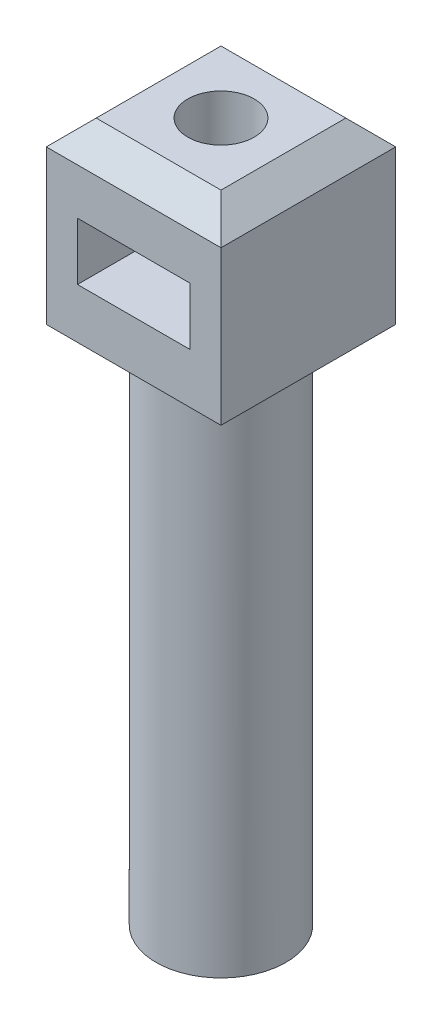
ISO-10303-21;
HEADER;
FILE_DESCRIPTION(('STEP AP214'),'2;1');
FILE_NAME('part.step','',(''),(''),'','','');
FILE_SCHEMA(('AUTOMOTIVE_DESIGN { 1 0 10303 214 1 1 1 1 }'));
ENDSEC;
DATA;
#1=APPLICATION_CONTEXT('core data for automotive mechanical design processes');
#2=APPLICATION_PROTOCOL_DEFINITION('international standard','automotive_design',2000,#1);
#3=PRODUCT_CONTEXT('',#1,'mechanical');
#4=PRODUCT('Part','Part','',(#3));
#5=PRODUCT_RELATED_PRODUCT_CATEGORY('part','',(#4));
#6=PRODUCT_DEFINITION_FORMATION('','',#4);
#7=PRODUCT_DEFINITION_CONTEXT('part definition',#1,'design');
#8=PRODUCT_DEFINITION('design','',#6,#7);
#9=PRODUCT_DEFINITION_SHAPE('','',#8);
#10=(LENGTH_UNIT() NAMED_UNIT(*) SI_UNIT(.MILLI.,.METRE.));
#11=(NAMED_UNIT(*) PLANE_ANGLE_UNIT() SI_UNIT($,.RADIAN.));
#12=(NAMED_UNIT(*) SI_UNIT($,.STERADIAN.) SOLID_ANGLE_UNIT());
#13=UNCERTAINTY_MEASURE_WITH_UNIT(LENGTH_MEASURE(1.E-05),#10,'distance_accuracy_value','');
#14=(GEOMETRIC_REPRESENTATION_CONTEXT(3) GLOBAL_UNCERTAINTY_ASSIGNED_CONTEXT((#13)) GLOBAL_UNIT_ASSIGNED_CONTEXT((#10,
#11,#12)) REPRESENTATION_CONTEXT('',''));
#15=CARTESIAN_POINT('',(0.,0.,0.));
#16=DIRECTION('',(0.,0.,1.));
#17=DIRECTION('',(1.,0.,0.));
#18=AXIS2_PLACEMENT_3D('',#15,#16,#17);
#19=CARTESIAN_POINT('',(0.,50.8,0.));
#20=DIRECTION('',(0.,-1.,0.));
#21=DIRECTION('',(0.,0.,-1.));
#22=AXIS2_PLACEMENT_3D('',#19,#20,#21);
#23=PLANE('',#22);
#24=DIRECTION('',(0.,0.,-1.));
#25=VECTOR('',#24,1.);
#26=CARTESIAN_POINT('',(-6.34999999999998,50.8,-8.89));
#27=LINE('',#26,#25);
#28=CARTESIAN_POINT('',(-6.34999999999998,50.8,-1.81392282084995));
#29=VERTEX_POINT('',#28);
#30=CARTESIAN_POINT('',(-6.34999999999998,50.8,-6.34999999999998));
#31=VERTEX_POINT('',#30);
#32=EDGE_CURVE('E191',#29,#31,#27,.T.);
#33=ORIENTED_EDGE('',*,*,#32,.T.);
#34=DIRECTION('',(1.,0.,0.));
#35=VECTOR('',#34,1.);
#36=CARTESIAN_POINT('',(8.89,50.8,-6.34999999999998));
#37=LINE('',#36,#35);
#38=CARTESIAN_POINT('',(-1.81392282084994,50.8,-6.34999999999998));
#39=VERTEX_POINT('',#38);
#40=EDGE_CURVE('E193',#31,#39,#37,.T.);
#41=ORIENTED_EDGE('',*,*,#40,.T.);
#42=CARTESIAN_POINT('',(0.,50.8,0.));
#43=DIRECTION('',(0.,-1.,0.));
#44=DIRECTION('',(0.,0.,-1.));
#45=AXIS2_PLACEMENT_3D('',#42,#43,#44);
#46=CIRCLE('',#45,6.604);
#47=EDGE_CURVE('E286',#29,#39,#46,.T.);
#48=ORIENTED_EDGE('',*,*,#47,.F.);
#49=EDGE_LOOP('',(#33,#41,#48));
#50=FACE_BOUND('',#49,.T.);
#51=ADVANCED_FACE('F32',(#50),#23,.T.);
#52=CARTESIAN_POINT('',(1.81392282084994,50.8,-6.34999999999998));
#53=VERTEX_POINT('',#52);
#54=CARTESIAN_POINT('',(6.34999999999999,50.8,-1.81392282084993));
#55=VERTEX_POINT('',#54);
#56=EDGE_CURVE('E156',#53,#55,#46,.T.);
#57=ORIENTED_EDGE('',*,*,#56,.F.);
#58=DIRECTION('',(1.,0.,0.));
#59=VECTOR('',#58,1.);
#60=CARTESIAN_POINT('',(8.89,50.8,-6.34999999999998));
#61=LINE('',#60,#59);
#62=CARTESIAN_POINT('',(6.34999999999999,50.8,-6.34999999999998));
#63=VERTEX_POINT('',#62);
#64=EDGE_CURVE('E189',#53,#63,#61,.T.);
#65=ORIENTED_EDGE('',*,*,#64,.T.);
#66=DIRECTION('',(0.,0.,1.));
#67=VECTOR('',#66,1.);
#68=CARTESIAN_POINT('',(6.34999999999999,50.8,8.89));
#69=LINE('',#68,#67);
#70=EDGE_CURVE('E187',#63,#55,#69,.T.);
#71=ORIENTED_EDGE('',*,*,#70,.T.);
#72=EDGE_LOOP('',(#57,#65,#71));
#73=FACE_BOUND('',#72,.T.);
#74=ADVANCED_FACE('F317',(#73),#23,.T.);
#75=CARTESIAN_POINT('',(6.34999999999999,50.8,1.81392282084993));
#76=VERTEX_POINT('',#75);
#77=CARTESIAN_POINT('',(1.81392282084994,50.8,6.34999999999998));
#78=VERTEX_POINT('',#77);
#79=EDGE_CURVE('E288',#76,#78,#46,.T.);
#80=ORIENTED_EDGE('',*,*,#79,.F.);
#81=DIRECTION('',(0.,0.,1.));
#82=VECTOR('',#81,1.);
#83=CARTESIAN_POINT('',(6.34999999999999,50.8,8.89));
#84=LINE('',#83,#82);
#85=CARTESIAN_POINT('',(6.34999999999999,50.8,6.34999999999998));
#86=VERTEX_POINT('',#85);
#87=EDGE_CURVE('E185',#76,#86,#84,.T.);
#88=ORIENTED_EDGE('',*,*,#87,.T.);
#89=DIRECTION('',(-1.,0.,0.));
#90=VECTOR('',#89,1.);
#91=CARTESIAN_POINT('',(-8.89,50.8,6.34999999999998));
#92=LINE('',#91,#90);
#93=EDGE_CURVE('E183',#86,#78,#92,.T.);
#94=ORIENTED_EDGE('',*,*,#93,.T.);
#95=EDGE_LOOP('',(#80,#88,#94));
#96=FACE_BOUND('',#95,.T.);
#97=ADVANCED_FACE('F338',(#96),#23,.T.);
#98=CARTESIAN_POINT('',(0.,63.5,0.));
#99=DIRECTION('',(0.,-1.,0.));
#100=DIRECTION('',(0.,0.,-1.));
#101=AXIS2_PLACEMENT_3D('',#98,#99,#100);
#102=CYLINDRICAL_SURFACE('',#101,6.604);
#103=ORIENTED_EDGE('',*,*,#56,.T.);
#104=CARTESIAN_POINT('',(0.,45.4717173420242,0.));
#105=DIRECTION('',(0.642787609686544,-0.766044443118974,0.));
#106=DIRECTION('',(-0.766044443118974,-0.642787609686544,0.));
#107=AXIS2_PLACEMENT_3D('',#104,#105,#106);
#108=ELLIPSE('',#107,8.62090973875041,6.604);
#109=EDGE_CURVE('E209',#55,#76,#108,.T.);
#110=ORIENTED_EDGE('',*,*,#109,.T.);
#111=ORIENTED_EDGE('',*,*,#79,.T.);
#112=CARTESIAN_POINT('',(0.,45.4717173420242,0.));
#113=DIRECTION('',(0.,-0.766044443118974,0.642787609686544));
#114=DIRECTION('',(0.,-0.642787609686544,-0.766044443118974));
#115=AXIS2_PLACEMENT_3D('',#112,#113,#114);
#116=ELLIPSE('',#115,8.62090973875041,6.604);
#117=CARTESIAN_POINT('',(-1.81392282084994,50.8,6.34999999999998));
#118=VERTEX_POINT('',#117);
#119=EDGE_CURVE('E211',#78,#118,#116,.T.);
#120=ORIENTED_EDGE('',*,*,#119,.T.);
#121=CARTESIAN_POINT('',(-6.34999999999998,50.8,1.81392282084995));
#122=VERTEX_POINT('',#121);
#123=EDGE_CURVE('E293',#118,#122,#46,.T.);
#124=ORIENTED_EDGE('',*,*,#123,.T.);
#125=CARTESIAN_POINT('',(0.,45.4717173420242,0.));
#126=DIRECTION('',(-0.642787609686544,-0.766044443118974,0.));
#127=DIRECTION('',(0.766044443118974,-0.642787609686544,0.));
#128=AXIS2_PLACEMENT_3D('',#125,#126,#127);
#129=ELLIPSE('',#128,8.62090973875041,6.604);
#130=EDGE_CURVE('E207',#122,#29,#129,.T.);
#131=ORIENTED_EDGE('',*,*,#130,.T.);
#132=ORIENTED_EDGE('',*,*,#47,.T.);
#133=CARTESIAN_POINT('',(0.,45.4717173420242,0.));
#134=DIRECTION('',(0.,-0.766044443118974,-0.642787609686544));
#135=DIRECTION('',(0.,-0.642787609686544,0.766044443118974));
#136=AXIS2_PLACEMENT_3D('',#133,#134,#135);
#137=ELLIPSE('',#136,8.62090973875041,6.604);
#138=EDGE_CURVE('E205',#39,#53,#137,.T.);
#139=ORIENTED_EDGE('',*,*,#138,.T.);
#140=EDGE_LOOP('',(#103,#110,#111,#120,#124,#131,#132,#139));
#141=FACE_BOUND('',#140,.T.);
#142=CARTESIAN_POINT('',(0.,0.,0.));
#143=DIRECTION('',(0.,-1.,0.));
#144=DIRECTION('',(0.,0.,-1.));
#145=AXIS2_PLACEMENT_3D('',#142,#143,#144);
#146=CIRCLE('',#145,6.604);
#147=CARTESIAN_POINT('',(0.,0.,-6.604));
#148=VERTEX_POINT('',#147);
#149=EDGE_CURVE('E218',#148,#148,#146,.T.);
#150=ORIENTED_EDGE('',*,*,#149,.F.);
#151=EDGE_LOOP('',(#150));
#152=FACE_BOUND('',#151,.T.);
#153=ADVANCED_FACE('F299',(#141,#152),#102,.T.);
#154=DIRECTION('',(-1.,0.,0.));
#155=VECTOR('',#154,1.);
#156=CARTESIAN_POINT('',(-8.89,50.8,6.34999999999998));
#157=LINE('',#156,#155);
#158=CARTESIAN_POINT('',(-6.34999999999998,50.8,6.34999999999998));
#159=VERTEX_POINT('',#158);
#160=EDGE_CURVE('E179',#118,#159,#157,.T.);
#161=ORIENTED_EDGE('',*,*,#160,.T.);
#162=DIRECTION('',(0.,0.,-1.));
#163=VECTOR('',#162,1.);
#164=CARTESIAN_POINT('',(-6.34999999999998,50.8,-8.89));
#165=LINE('',#164,#163);
#166=EDGE_CURVE('E181',#159,#122,#165,.T.);
#167=ORIENTED_EDGE('',*,*,#166,.T.);
#168=ORIENTED_EDGE('',*,*,#123,.F.);
#169=EDGE_LOOP('',(#161,#167,#168));
#170=FACE_BOUND('',#169,.T.);
#171=ADVANCED_FACE('F341',(#170),#23,.T.);
#172=CARTESIAN_POINT('',(8.89,71.12,8.89));
#173=DIRECTION('',(-1.,0.,0.));
#174=DIRECTION('',(0.,0.,1.));
#175=AXIS2_PLACEMENT_3D('',#172,#173,#174);
#176=PLANE('',#175);
#177=DIRECTION('',(0.,-1.,0.));
#178=VECTOR('',#177,1.);
#179=CARTESIAN_POINT('',(8.89,71.12,-8.89));
#180=LINE('',#179,#178);
#181=CARTESIAN_POINT('',(8.89,68.58,-8.89));
#182=VERTEX_POINT('',#181);
#183=CARTESIAN_POINT('',(8.89,52.9313130631903,-8.89));
#184=VERTEX_POINT('',#183);
#185=EDGE_CURVE('E285',#182,#184,#180,.T.);
#186=ORIENTED_EDGE('',*,*,#185,.F.);
#187=DIRECTION('',(0.,0.,1.));
#188=VECTOR('',#187,1.);
#189=CARTESIAN_POINT('',(8.89,68.58,8.89));
#190=LINE('',#189,#188);
#191=CARTESIAN_POINT('',(8.89,68.58,8.89));
#192=VERTEX_POINT('',#191);
#193=EDGE_CURVE('E229',#182,#192,#190,.T.);
#194=ORIENTED_EDGE('',*,*,#193,.T.);
#195=DIRECTION('',(0.,-1.,0.));
#196=VECTOR('',#195,1.);
#197=CARTESIAN_POINT('',(8.89,71.12,8.89));
#198=LINE('',#197,#196);
#199=CARTESIAN_POINT('',(8.89,52.9313130631903,8.89));
#200=VERTEX_POINT('',#199);
#201=EDGE_CURVE('E279',#192,#200,#198,.T.);
#202=ORIENTED_EDGE('',*,*,#201,.T.);
#203=DIRECTION('',(0.,0.,-1.));
#204=VECTOR('',#203,1.);
#205=CARTESIAN_POINT('',(8.89,52.9313130631903,-8.89));
#206=LINE('',#205,#204);
#207=EDGE_CURVE('E199',#200,#184,#206,.T.);
#208=ORIENTED_EDGE('',*,*,#207,.T.);
#209=EDGE_LOOP('',(#186,#194,#202,#208));
#210=FACE_BOUND('',#209,.T.);
#211=ADVANCED_FACE('F329',(#210),#176,.F.);
#212=CARTESIAN_POINT('',(-8.89,71.12,-8.89));
#213=DIRECTION('',(0.,0.,1.));
#214=DIRECTION('',(1.,0.,0.));
#215=AXIS2_PLACEMENT_3D('',#212,#213,#214);
#216=PLANE('',#215);
#217=DIRECTION('',(1.,0.,0.));
#218=VECTOR('',#217,1.);
#219=CARTESIAN_POINT('',(-8.89,58.039,-8.89));
#220=LINE('',#219,#218);
#221=CARTESIAN_POINT('',(-5.71500000000003,58.039,-8.89));
#222=VERTEX_POINT('',#221);
#223=CARTESIAN_POINT('',(5.71499999999997,58.039,-8.89));
#224=VERTEX_POINT('',#223);
#225=EDGE_CURVE('E273',#222,#224,#220,.T.);
#226=ORIENTED_EDGE('',*,*,#225,.T.);
#227=DIRECTION('',(0.,1.,0.));
#228=VECTOR('',#227,1.);
#229=CARTESIAN_POINT('',(5.71499999999997,71.12,-8.89));
#230=LINE('',#229,#228);
#231=CARTESIAN_POINT('',(5.71499999999997,63.881,-8.89));
#232=VERTEX_POINT('',#231);
#233=EDGE_CURVE('E276',#224,#232,#230,.T.);
#234=ORIENTED_EDGE('',*,*,#233,.T.);
#235=DIRECTION('',(-1.,0.,0.));
#236=VECTOR('',#235,1.);
#237=CARTESIAN_POINT('',(-8.89,63.881,-8.89));
#238=LINE('',#237,#236);
#239=CARTESIAN_POINT('',(-5.71500000000003,63.881,-8.89));
#240=VERTEX_POINT('',#239);
#241=EDGE_CURVE('E268',#232,#240,#238,.T.);
#242=ORIENTED_EDGE('',*,*,#241,.T.);
#243=DIRECTION('',(0.,-1.,0.));
#244=VECTOR('',#243,1.);
#245=CARTESIAN_POINT('',(-5.71500000000003,71.12,-8.89));
#246=LINE('',#245,#244);
#247=EDGE_CURVE('E163',#240,#222,#246,.T.);
#248=ORIENTED_EDGE('',*,*,#247,.T.);
#249=EDGE_LOOP('',(#226,#234,#242,#248));
#250=FACE_BOUND('',#249,.T.);
#251=DIRECTION('',(0.,-1.,0.));
#252=VECTOR('',#251,1.);
#253=CARTESIAN_POINT('',(-8.89,71.12,-8.89));
#254=LINE('',#253,#252);
#255=CARTESIAN_POINT('',(-8.89,68.58,-8.89));
#256=VERTEX_POINT('',#255);
#257=CARTESIAN_POINT('',(-8.89,52.9313130631903,-8.89));
#258=VERTEX_POINT('',#257);
#259=EDGE_CURVE('E283',#256,#258,#254,.T.);
#260=ORIENTED_EDGE('',*,*,#259,.F.);
#261=DIRECTION('',(1.,0.,0.));
#262=VECTOR('',#261,1.);
#263=CARTESIAN_POINT('',(-8.89,68.58,-8.89));
#264=LINE('',#263,#262);
#265=EDGE_CURVE('E239',#256,#182,#264,.T.);
#266=ORIENTED_EDGE('',*,*,#265,.T.);
#267=ORIENTED_EDGE('',*,*,#185,.T.);
#268=DIRECTION('',(-1.,0.,0.));
#269=VECTOR('',#268,1.);
#270=CARTESIAN_POINT('',(-8.89,52.9313130631903,-8.89));
#271=LINE('',#270,#269);
#272=EDGE_CURVE('E176',#184,#258,#271,.T.);
#273=ORIENTED_EDGE('',*,*,#272,.T.);
#274=EDGE_LOOP('',(#260,#266,#267,#273));
#275=FACE_BOUND('',#274,.T.);
#276=ADVANCED_FACE('F325',(#250,#275),#216,.F.);
#277=CARTESIAN_POINT('',(-8.89,71.12,8.89));
#278=DIRECTION('',(1.,0.,0.));
#279=DIRECTION('',(0.,0.,-1.));
#280=AXIS2_PLACEMENT_3D('',#277,#278,#279);
#281=PLANE('',#280);
#282=DIRECTION('',(0.,-1.,0.));
#283=VECTOR('',#282,1.);
#284=CARTESIAN_POINT('',(-8.89,71.12,8.89));
#285=LINE('',#284,#283);
#286=CARTESIAN_POINT('',(-8.89,68.58,8.89));
#287=VERTEX_POINT('',#286);
#288=CARTESIAN_POINT('',(-8.89,52.9313130631903,8.89));
#289=VERTEX_POINT('',#288);
#290=EDGE_CURVE('E281',#287,#289,#285,.T.);
#291=ORIENTED_EDGE('',*,*,#290,.F.);
#292=DIRECTION('',(0.,0.,-1.));
#293=VECTOR('',#292,1.);
#294=CARTESIAN_POINT('',(-8.89,68.58,8.89));
#295=LINE('',#294,#293);
#296=EDGE_CURVE('E41',#287,#256,#295,.T.);
#297=ORIENTED_EDGE('',*,*,#296,.T.);
#298=ORIENTED_EDGE('',*,*,#259,.T.);
#299=DIRECTION('',(0.,0.,1.));
#300=VECTOR('',#299,1.);
#301=CARTESIAN_POINT('',(-8.89,52.9313130631903,8.89));
#302=LINE('',#301,#300);
#303=EDGE_CURVE('E196',#258,#289,#302,.T.);
#304=ORIENTED_EDGE('',*,*,#303,.T.);
#305=EDGE_LOOP('',(#291,#297,#298,#304));
#306=FACE_BOUND('',#305,.T.);
#307=ADVANCED_FACE('F457',(#306),#281,.F.);
#308=CARTESIAN_POINT('',(-8.89,71.12,8.89));
#309=DIRECTION('',(0.,0.,-1.));
#310=DIRECTION('',(-1.,0.,0.));
#311=AXIS2_PLACEMENT_3D('',#308,#309,#310);
#312=PLANE('',#311);
#313=DIRECTION('',(1.,0.,0.));
#314=VECTOR('',#313,1.);
#315=CARTESIAN_POINT('',(-8.89,63.881,8.89));
#316=LINE('',#315,#314);
#317=CARTESIAN_POINT('',(-5.71500000000003,63.881,8.89));
#318=VERTEX_POINT('',#317);
#319=CARTESIAN_POINT('',(5.71499999999997,63.881,8.89));
#320=VERTEX_POINT('',#319);
#321=EDGE_CURVE('E144',#318,#320,#316,.T.);
#322=ORIENTED_EDGE('',*,*,#321,.T.);
#323=DIRECTION('',(0.,-1.,0.));
#324=VECTOR('',#323,1.);
#325=CARTESIAN_POINT('',(5.71499999999997,71.12,8.89));
#326=LINE('',#325,#324);
#327=CARTESIAN_POINT('',(5.71499999999997,58.039,8.89));
#328=VERTEX_POINT('',#327);
#329=EDGE_CURVE('E171',#320,#328,#326,.T.);
#330=ORIENTED_EDGE('',*,*,#329,.T.);
#331=DIRECTION('',(-1.,0.,0.));
#332=VECTOR('',#331,1.);
#333=CARTESIAN_POINT('',(-8.89,58.039,8.89));
#334=LINE('',#333,#332);
#335=CARTESIAN_POINT('',(-5.71500000000003,58.039,8.89));
#336=VERTEX_POINT('',#335);
#337=EDGE_CURVE('E169',#328,#336,#334,.T.);
#338=ORIENTED_EDGE('',*,*,#337,.T.);
#339=DIRECTION('',(0.,1.,0.));
#340=VECTOR('',#339,1.);
#341=CARTESIAN_POINT('',(-5.71500000000003,71.12,8.89));
#342=LINE('',#341,#340);
#343=EDGE_CURVE('E155',#336,#318,#342,.T.);
#344=ORIENTED_EDGE('',*,*,#343,.T.);
#345=EDGE_LOOP('',(#322,#330,#338,#344));
#346=FACE_BOUND('',#345,.T.);
#347=ORIENTED_EDGE('',*,*,#201,.F.);
#348=DIRECTION('',(-1.,0.,0.));
#349=VECTOR('',#348,1.);
#350=CARTESIAN_POINT('',(-8.89,68.58,8.89));
#351=LINE('',#350,#349);
#352=EDGE_CURVE('E11',#192,#287,#351,.T.);
#353=ORIENTED_EDGE('',*,*,#352,.T.);
#354=ORIENTED_EDGE('',*,*,#290,.T.);
#355=DIRECTION('',(1.,0.,0.));
#356=VECTOR('',#355,1.);
#357=CARTESIAN_POINT('',(8.89,52.9313130631903,8.89));
#358=LINE('',#357,#356);
#359=EDGE_CURVE('E202',#289,#200,#358,.T.);
#360=ORIENTED_EDGE('',*,*,#359,.T.);
#361=EDGE_LOOP('',(#347,#353,#354,#360));
#362=FACE_BOUND('',#361,.T.);
#363=ADVANCED_FACE('F168',(#346,#362),#312,.F.);
#364=CARTESIAN_POINT('',(0.,71.12,0.));
#365=DIRECTION('',(0.,-1.,0.));
#366=DIRECTION('',(0.,0.,-1.));
#367=AXIS2_PLACEMENT_3D('',#364,#365,#366);
#368=PLANE('',#367);
#369=CARTESIAN_POINT('',(0.,71.12,0.));
#370=DIRECTION('',(0.,1.,0.));
#371=DIRECTION('',(0.,0.,1.));
#372=AXIS2_PLACEMENT_3D('',#369,#370,#371);
#373=CIRCLE('',#372,3.37819999999999);
#374=CARTESIAN_POINT('',(0.,71.12,3.37819999999999));
#375=VERTEX_POINT('',#374);
#376=EDGE_CURVE('E252',#375,#375,#373,.T.);
#377=ORIENTED_EDGE('',*,*,#376,.F.);
#378=EDGE_LOOP('',(#377));
#379=FACE_BOUND('',#378,.T.);
#380=DIRECTION('',(0.,0.,-1.));
#381=VECTOR('',#380,1.);
#382=CARTESIAN_POINT('',(6.35,71.12,0.));
#383=LINE('',#382,#381);
#384=CARTESIAN_POINT('',(6.35,71.12,6.35));
#385=VERTEX_POINT('',#384);
#386=CARTESIAN_POINT('',(6.35,71.12,-6.35));
#387=VERTEX_POINT('',#386);
#388=EDGE_CURVE('E213',#385,#387,#383,.T.);
#389=ORIENTED_EDGE('',*,*,#388,.T.);
#390=DIRECTION('',(-1.,0.,0.));
#391=VECTOR('',#390,1.);
#392=CARTESIAN_POINT('',(0.,71.12,-6.35));
#393=LINE('',#392,#391);
#394=CARTESIAN_POINT('',(-6.35,71.12,-6.35));
#395=VERTEX_POINT('',#394);
#396=EDGE_CURVE('E236',#387,#395,#393,.T.);
#397=ORIENTED_EDGE('',*,*,#396,.T.);
#398=DIRECTION('',(0.,0.,1.));
#399=VECTOR('',#398,1.);
#400=CARTESIAN_POINT('',(-6.35,71.12,0.));
#401=LINE('',#400,#399);
#402=CARTESIAN_POINT('',(-6.35,71.12,6.35));
#403=VERTEX_POINT('',#402);
#404=EDGE_CURVE('E234',#395,#403,#401,.T.);
#405=ORIENTED_EDGE('',*,*,#404,.T.);
#406=DIRECTION('',(1.,0.,0.));
#407=VECTOR('',#406,1.);
#408=CARTESIAN_POINT('',(0.,71.12,6.35));
#409=LINE('',#408,#407);
#410=EDGE_CURVE('E232',#403,#385,#409,.T.);
#411=ORIENTED_EDGE('',*,*,#410,.T.);
#412=EDGE_LOOP('',(#389,#397,#405,#411));
#413=FACE_BOUND('',#412,.T.);
#414=ADVANCED_FACE('F475',(#379,#413),#368,.F.);
#415=CARTESIAN_POINT('',(5.71499999999997,58.039,-12.7));
#416=DIRECTION('',(1.,0.,0.));
#417=DIRECTION('',(0.,0.,-1.));
#418=AXIS2_PLACEMENT_3D('',#415,#416,#417);
#419=PLANE('',#418);
#420=DIRECTION('',(0.,0.,1.));
#421=VECTOR('',#420,1.);
#422=CARTESIAN_POINT('',(5.71499999999997,58.039,-12.7));
#423=LINE('',#422,#421);
#424=EDGE_CURVE('E265',#224,#328,#423,.T.);
#425=ORIENTED_EDGE('',*,*,#424,.T.);
#426=ORIENTED_EDGE('',*,*,#329,.F.);
#427=DIRECTION('',(0.,0.,1.));
#428=VECTOR('',#427,1.);
#429=CARTESIAN_POINT('',(5.71499999999997,63.881,-12.7));
#430=LINE('',#429,#428);
#431=EDGE_CURVE('E150',#232,#320,#430,.T.);
#432=ORIENTED_EDGE('',*,*,#431,.F.);
#433=ORIENTED_EDGE('',*,*,#233,.F.);
#434=EDGE_LOOP('',(#425,#426,#432,#433));
#435=FACE_BOUND('',#434,.T.);
#436=ADVANCED_FACE('F483',(#435),#419,.F.);
#437=CARTESIAN_POINT('',(-5.71500000000003,58.039,-12.7));
#438=DIRECTION('',(0.,-1.,0.));
#439=DIRECTION('',(0.,0.,-1.));
#440=AXIS2_PLACEMENT_3D('',#437,#438,#439);
#441=PLANE('',#440);
#442=DIRECTION('',(0.,0.,1.));
#443=VECTOR('',#442,1.);
#444=CARTESIAN_POINT('',(-5.71500000000003,58.039,-12.7));
#445=LINE('',#444,#443);
#446=EDGE_CURVE('E165',#222,#336,#445,.T.);
#447=ORIENTED_EDGE('',*,*,#446,.T.);
#448=ORIENTED_EDGE('',*,*,#337,.F.);
#449=ORIENTED_EDGE('',*,*,#424,.F.);
#450=ORIENTED_EDGE('',*,*,#225,.F.);
#451=EDGE_LOOP('',(#447,#448,#449,#450));
#452=FACE_BOUND('',#451,.T.);
#453=ADVANCED_FACE('F529',(#452),#441,.F.);
#454=CARTESIAN_POINT('',(-5.71500000000003,58.039,-12.7));
#455=DIRECTION('',(-1.,0.,0.));
#456=DIRECTION('',(0.,0.,1.));
#457=AXIS2_PLACEMENT_3D('',#454,#455,#456);
#458=PLANE('',#457);
#459=DIRECTION('',(0.,0.,1.));
#460=VECTOR('',#459,1.);
#461=CARTESIAN_POINT('',(-5.71500000000003,63.881,-12.7));
#462=LINE('',#461,#460);
#463=EDGE_CURVE('E147',#240,#318,#462,.T.);
#464=ORIENTED_EDGE('',*,*,#463,.T.);
#465=ORIENTED_EDGE('',*,*,#343,.F.);
#466=ORIENTED_EDGE('',*,*,#446,.F.);
#467=ORIENTED_EDGE('',*,*,#247,.F.);
#468=EDGE_LOOP('',(#464,#465,#466,#467));
#469=FACE_BOUND('',#468,.T.);
#470=ADVANCED_FACE('F159',(#469),#458,.F.);
#471=CARTESIAN_POINT('',(-5.71500000000003,63.881,-12.7));
#472=DIRECTION('',(0.,1.,0.));
#473=DIRECTION('',(0.,0.,1.));
#474=AXIS2_PLACEMENT_3D('',#471,#472,#473);
#475=PLANE('',#474);
#476=CARTESIAN_POINT('',(0.,63.881,0.));
#477=DIRECTION('',(0.,1.,0.));
#478=DIRECTION('',(0.,0.,1.));
#479=AXIS2_PLACEMENT_3D('',#476,#477,#478);
#480=CIRCLE('',#479,3.3782);
#481=CARTESIAN_POINT('',(0.,63.881,3.3782));
#482=VERTEX_POINT('',#481);
#483=EDGE_CURVE('E256',#482,#482,#480,.T.);
#484=ORIENTED_EDGE('',*,*,#483,.T.);
#485=EDGE_LOOP('',(#484));
#486=FACE_BOUND('',#485,.T.);
#487=ORIENTED_EDGE('',*,*,#431,.T.);
#488=ORIENTED_EDGE('',*,*,#321,.F.);
#489=ORIENTED_EDGE('',*,*,#463,.F.);
#490=ORIENTED_EDGE('',*,*,#241,.F.);
#491=EDGE_LOOP('',(#487,#488,#489,#490));
#492=FACE_BOUND('',#491,.T.);
#493=ADVANCED_FACE('F146',(#486,#492),#475,.F.);
#494=CARTESIAN_POINT('',(-8.89,52.9313130631903,8.89));
#495=DIRECTION('',(0.,-0.766044443118974,0.642787609686544));
#496=DIRECTION('',(-1.,0.,0.));
#497=AXIS2_PLACEMENT_3D('',#494,#495,#496);
#498=PLANE('',#497);
#499=ORIENTED_EDGE('',*,*,#119,.F.);
#500=ORIENTED_EDGE('',*,*,#93,.F.);
#501=DIRECTION('',(0.608120402411341,0.510273605374742,0.608120402411341));
#502=VECTOR('',#501,1.);
#503=CARTESIAN_POINT('',(2.31477066432161,47.4140405527165,2.3147706643216));
#504=LINE('',#503,#502);
#505=EDGE_CURVE('E224',#200,#86,#504,.F.);
#506=ORIENTED_EDGE('',*,*,#505,.F.);
#507=ORIENTED_EDGE('',*,*,#359,.F.);
#508=DIRECTION('',(0.608120402411341,-0.510273605374742,-0.608120402411341));
#509=VECTOR('',#508,1.);
#510=CARTESIAN_POINT('',(-8.89,52.9313130631903,8.89));
#511=LINE('',#510,#509);
#512=EDGE_CURVE('E221',#159,#289,#511,.F.);
#513=ORIENTED_EDGE('',*,*,#512,.F.);
#514=ORIENTED_EDGE('',*,*,#160,.F.);
#515=EDGE_LOOP('',(#499,#500,#506,#507,#513,#514));
#516=FACE_BOUND('',#515,.T.);
#517=ADVANCED_FACE('F334',(#516),#498,.T.);
#518=CARTESIAN_POINT('',(8.89,52.9313130631903,8.89));
#519=DIRECTION('',(0.642787609686544,-0.766044443118974,0.));
#520=DIRECTION('',(0.,0.,1.));
#521=AXIS2_PLACEMENT_3D('',#518,#519,#520);
#522=PLANE('',#521);
#523=ORIENTED_EDGE('',*,*,#109,.F.);
#524=ORIENTED_EDGE('',*,*,#70,.F.);
#525=DIRECTION('',(0.608120402411341,0.510273605374742,-0.608120402411341));
#526=VECTOR('',#525,1.);
#527=CARTESIAN_POINT('',(2.3147706643216,47.4140405527165,-2.3147706643216));
#528=LINE('',#527,#526);
#529=EDGE_CURVE('E217',#184,#63,#528,.F.);
#530=ORIENTED_EDGE('',*,*,#529,.F.);
#531=ORIENTED_EDGE('',*,*,#207,.F.);
#532=ORIENTED_EDGE('',*,*,#505,.T.);
#533=ORIENTED_EDGE('',*,*,#87,.F.);
#534=EDGE_LOOP('',(#523,#524,#530,#531,#532,#533));
#535=FACE_BOUND('',#534,.T.);
#536=ADVANCED_FACE('F321',(#535),#522,.T.);
#537=CARTESIAN_POINT('',(-8.89,52.9313130631903,8.89));
#538=DIRECTION('',(-0.642787609686544,-0.766044443118974,0.));
#539=DIRECTION('',(0.,0.,-1.));
#540=AXIS2_PLACEMENT_3D('',#537,#538,#539);
#541=PLANE('',#540);
#542=ORIENTED_EDGE('',*,*,#512,.T.);
#543=ORIENTED_EDGE('',*,*,#303,.F.);
#544=DIRECTION('',(0.608120402411341,-0.510273605374742,0.608120402411341));
#545=VECTOR('',#544,1.);
#546=CARTESIAN_POINT('',(-2.3147706643216,47.4140405527165,-2.3147706643216));
#547=LINE('',#546,#545);
#548=EDGE_CURVE('E214',#31,#258,#547,.F.);
#549=ORIENTED_EDGE('',*,*,#548,.F.);
#550=ORIENTED_EDGE('',*,*,#32,.F.);
#551=ORIENTED_EDGE('',*,*,#130,.F.);
#552=ORIENTED_EDGE('',*,*,#166,.F.);
#553=EDGE_LOOP('',(#542,#543,#549,#550,#551,#552));
#554=FACE_BOUND('',#553,.T.);
#555=ADVANCED_FACE('F307',(#554),#541,.T.);
#556=CARTESIAN_POINT('',(-8.89,52.9313130631903,-8.89));
#557=DIRECTION('',(0.,-0.766044443118974,-0.642787609686544));
#558=DIRECTION('',(1.,0.,0.));
#559=AXIS2_PLACEMENT_3D('',#556,#557,#558);
#560=PLANE('',#559);
#561=ORIENTED_EDGE('',*,*,#138,.F.);
#562=ORIENTED_EDGE('',*,*,#40,.F.);
#563=ORIENTED_EDGE('',*,*,#548,.T.);
#564=ORIENTED_EDGE('',*,*,#272,.F.);
#565=ORIENTED_EDGE('',*,*,#529,.T.);
#566=ORIENTED_EDGE('',*,*,#64,.F.);
#567=EDGE_LOOP('',(#561,#562,#563,#564,#565,#566));
#568=FACE_BOUND('',#567,.T.);
#569=ADVANCED_FACE('F313',(#568),#560,.T.);
#570=CARTESIAN_POINT('',(0.,0.,0.));
#571=DIRECTION('',(0.,-1.,0.));
#572=DIRECTION('',(0.,0.,-1.));
#573=AXIS2_PLACEMENT_3D('',#570,#571,#572);
#574=PLANE('',#573);
#575=ORIENTED_EDGE('',*,*,#149,.T.);
#576=EDGE_LOOP('',(#575));
#577=FACE_BOUND('',#576,.T.);
#578=ADVANCED_FACE('F411',(#577),#574,.T.);
#579=CARTESIAN_POINT('',(0.,71.12,0.));
#580=DIRECTION('',(0.,1.,0.));
#581=DIRECTION('',(0.,0.,1.));
#582=AXIS2_PLACEMENT_3D('',#579,#580,#581);
#583=CYLINDRICAL_SURFACE('',#582,3.3782);
#584=ORIENTED_EDGE('',*,*,#483,.F.);
#585=EDGE_LOOP('',(#584));
#586=FACE_BOUND('',#585,.T.);
#587=ORIENTED_EDGE('',*,*,#376,.T.);
#588=EDGE_LOOP('',(#587));
#589=FACE_BOUND('',#588,.T.);
#590=ADVANCED_FACE('F420',(#586,#589),#583,.F.);
#591=CARTESIAN_POINT('',(6.35,71.12,0.));
#592=DIRECTION('',(-0.70710678118655,-0.707106781186546,0.));
#593=DIRECTION('',(0.,0.,-1.));
#594=AXIS2_PLACEMENT_3D('',#591,#592,#593);
#595=PLANE('',#594);
#596=ORIENTED_EDGE('',*,*,#193,.F.);
#597=DIRECTION('',(-0.577350269189625,0.577350269189628,0.577350269189625));
#598=VECTOR('',#597,1.);
#599=CARTESIAN_POINT('',(4.23333333333334,73.2366666666667,-4.23333333333334));
#600=LINE('',#599,#598);
#601=EDGE_CURVE('E243',#182,#387,#600,.T.);
#602=ORIENTED_EDGE('',*,*,#601,.T.);
#603=ORIENTED_EDGE('',*,*,#388,.F.);
#604=DIRECTION('',(0.577350269189625,-0.577350269189628,0.577350269189625));
#605=VECTOR('',#604,1.);
#606=CARTESIAN_POINT('',(4.23333333333334,73.2366666666667,4.23333333333334));
#607=LINE('',#606,#605);
#608=EDGE_CURVE('E241',#385,#192,#607,.T.);
#609=ORIENTED_EDGE('',*,*,#608,.T.);
#610=EDGE_LOOP('',(#596,#602,#603,#609));
#611=FACE_BOUND('',#610,.T.);
#612=ADVANCED_FACE('F439',(#611),#595,.F.);
#613=CARTESIAN_POINT('',(0.,71.12,6.35));
#614=DIRECTION('',(0.,-0.707106781186546,-0.70710678118655));
#615=DIRECTION('',(1.,0.,0.));
#616=AXIS2_PLACEMENT_3D('',#613,#614,#615);
#617=PLANE('',#616);
#618=ORIENTED_EDGE('',*,*,#608,.F.);
#619=ORIENTED_EDGE('',*,*,#410,.F.);
#620=DIRECTION('',(-0.577350269189625,-0.577350269189628,0.577350269189625));
#621=VECTOR('',#620,1.);
#622=CARTESIAN_POINT('',(-4.23333333333334,73.2366666666667,4.23333333333334));
#623=LINE('',#622,#621);
#624=EDGE_CURVE('E36',#287,#403,#623,.F.);
#625=ORIENTED_EDGE('',*,*,#624,.F.);
#626=ORIENTED_EDGE('',*,*,#352,.F.);
#627=EDGE_LOOP('',(#618,#619,#625,#626));
#628=FACE_BOUND('',#627,.T.);
#629=ADVANCED_FACE('F34',(#628),#617,.F.);
#630=CARTESIAN_POINT('',(-6.35,71.12,0.));
#631=DIRECTION('',(0.70710678118655,-0.707106781186546,0.));
#632=DIRECTION('',(0.,0.,1.));
#633=AXIS2_PLACEMENT_3D('',#630,#631,#632);
#634=PLANE('',#633);
#635=ORIENTED_EDGE('',*,*,#624,.T.);
#636=ORIENTED_EDGE('',*,*,#404,.F.);
#637=DIRECTION('',(-0.577350269189625,-0.577350269189628,-0.577350269189625));
#638=VECTOR('',#637,1.);
#639=CARTESIAN_POINT('',(-4.23333333333334,73.2366666666667,-4.23333333333334));
#640=LINE('',#639,#638);
#641=EDGE_CURVE('E245',#256,#395,#640,.F.);
#642=ORIENTED_EDGE('',*,*,#641,.F.);
#643=ORIENTED_EDGE('',*,*,#296,.F.);
#644=EDGE_LOOP('',(#635,#636,#642,#643));
#645=FACE_BOUND('',#644,.T.);
#646=ADVANCED_FACE('F501',(#645),#634,.F.);
#647=CARTESIAN_POINT('',(0.,71.12,-6.35));
#648=DIRECTION('',(0.,-0.707106781186546,0.70710678118655));
#649=DIRECTION('',(-1.,0.,0.));
#650=AXIS2_PLACEMENT_3D('',#647,#648,#649);
#651=PLANE('',#650);
#652=ORIENTED_EDGE('',*,*,#601,.F.);
#653=ORIENTED_EDGE('',*,*,#265,.F.);
#654=ORIENTED_EDGE('',*,*,#641,.T.);
#655=ORIENTED_EDGE('',*,*,#396,.F.);
#656=EDGE_LOOP('',(#652,#653,#654,#655));
#657=FACE_BOUND('',#656,.T.);
#658=ADVANCED_FACE('F510',(#657),#651,.F.);
#659=CLOSED_SHELL('',(#51,#74,#97,#153,#171,#211,#276,#307,#363,#414,#436,#453,#470,#493,#517,
#536,#555,#569,#578,#590,#612,#629,#646,#658));
#660=MANIFOLD_SOLID_BREP('B2',#659);
#661=ADVANCED_BREP_SHAPE_REPRESENTATION('',(#18,#660),#14);
#662=SHAPE_DEFINITION_REPRESENTATION(#9,#661);
ENDSEC;
END-ISO-10303-21;
